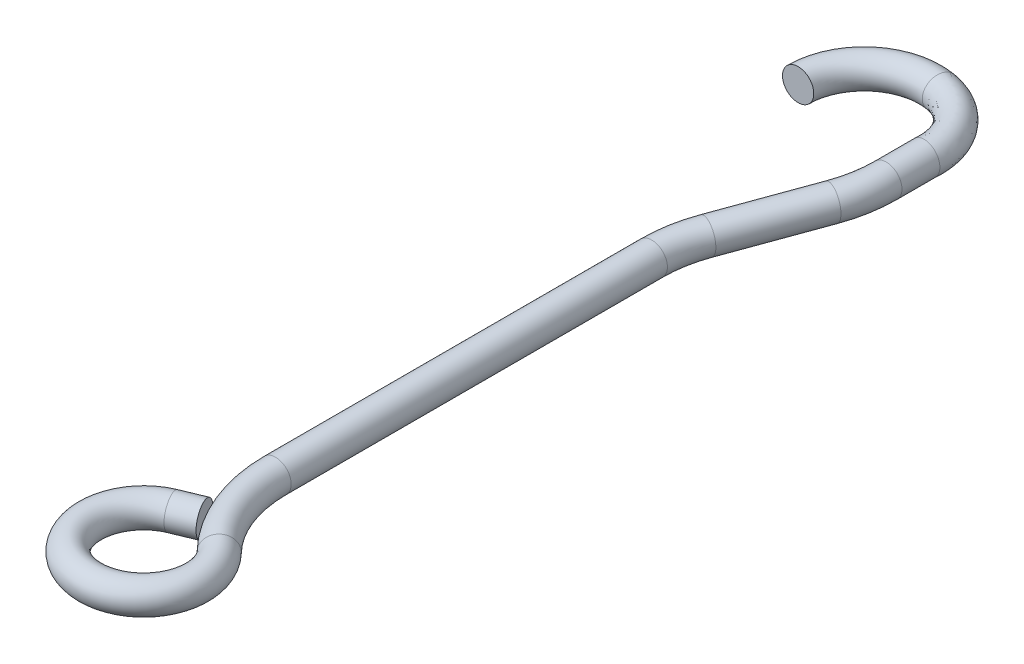
ISO-10303-21;
HEADER;
FILE_DESCRIPTION(('STEP AP214'),'2;1');
FILE_NAME('part.step','',(''),(''),'','','');
FILE_SCHEMA(('AUTOMOTIVE_DESIGN { 1 0 10303 214 1 1 1 1 }'));
ENDSEC;
DATA;
#1=APPLICATION_CONTEXT('core data for automotive mechanical design processes');
#2=APPLICATION_PROTOCOL_DEFINITION('international standard','automotive_design',2000,#1);
#3=PRODUCT_CONTEXT('',#1,'mechanical');
#4=PRODUCT('Part','Part','',(#3));
#5=PRODUCT_RELATED_PRODUCT_CATEGORY('part','',(#4));
#6=PRODUCT_DEFINITION_FORMATION('','',#4);
#7=PRODUCT_DEFINITION_CONTEXT('part definition',#1,'design');
#8=PRODUCT_DEFINITION('design','',#6,#7);
#9=PRODUCT_DEFINITION_SHAPE('','',#8);
#10=(LENGTH_UNIT() NAMED_UNIT(*) SI_UNIT(.MILLI.,.METRE.));
#11=(NAMED_UNIT(*) PLANE_ANGLE_UNIT() SI_UNIT($,.RADIAN.));
#12=(NAMED_UNIT(*) SI_UNIT($,.STERADIAN.) SOLID_ANGLE_UNIT());
#13=UNCERTAINTY_MEASURE_WITH_UNIT(LENGTH_MEASURE(1.E-05),#10,'distance_accuracy_value','');
#14=(GEOMETRIC_REPRESENTATION_CONTEXT(3) GLOBAL_UNCERTAINTY_ASSIGNED_CONTEXT((#13)) GLOBAL_UNIT_ASSIGNED_CONTEXT((#10,
#11,#12)) REPRESENTATION_CONTEXT('',''));
#15=CARTESIAN_POINT('',(0.,0.,0.));
#16=DIRECTION('',(0.,0.,1.));
#17=DIRECTION('',(1.,0.,0.));
#18=AXIS2_PLACEMENT_3D('',#15,#16,#17);
#19=CARTESIAN_POINT('',(0.155683718876011,0.,-0.389798905004367));
#20=DIRECTION('',(0.923582164777119,0.,-0.383400554127939));
#21=DIRECTION('',(-0.383400554127939,0.,-0.923582164777119));
#22=AXIS2_PLACEMENT_3D('',#19,#20,#21);
#23=PLANE('',#22);
#24=CARTESIAN_POINT('',(0.155683718876011,0.,-0.389798905004367));
#25=DIRECTION('',(0.923582164777119,0.,-0.383400554127939));
#26=DIRECTION('',(-0.383400554127939,0.,-0.923582164777119));
#27=AXIS2_PLACEMENT_3D('',#24,#25,#26);
#28=CIRCLE('',#27,1.15);
#29=CARTESIAN_POINT('',(-0.285226918371119,0.,-1.45191839449805));
#30=VERTEX_POINT('',#29);
#31=EDGE_CURVE('E53',#30,#30,#28,.T.);
#32=ORIENTED_EDGE('',*,*,#31,.T.);
#33=EDGE_LOOP('',(#32));
#34=FACE_BOUND('',#33,.T.);
#35=ADVANCED_FACE('F51',(#34),#23,.T.);
#36=CARTESIAN_POINT('',(-5.66038446641563,0.,-49.8347110424094));
#37=DIRECTION('',(0.,0.,-1.));
#38=DIRECTION('',(-1.,0.,0.));
#39=AXIS2_PLACEMENT_3D('',#36,#37,#38);
#40=PLANE('',#39);
#41=CARTESIAN_POINT('',(-5.66038446641563,0.,-49.8347110424094));
#42=DIRECTION('',(0.,0.,-1.));
#43=DIRECTION('',(-1.,0.,0.));
#44=AXIS2_PLACEMENT_3D('',#41,#42,#43);
#45=CIRCLE('',#44,1.15);
#46=CARTESIAN_POINT('',(-6.81038446641563,0.,-49.8347110424094));
#47=VERTEX_POINT('',#46);
#48=EDGE_CURVE('E73',#47,#47,#45,.T.);
#49=ORIENTED_EDGE('',*,*,#48,.F.);
#50=EDGE_LOOP('',(#49));
#51=FACE_BOUND('',#50,.T.);
#52=ADVANCED_FACE('F100',(#51),#40,.F.);
#53=CARTESIAN_POINT('',(-6.34038446641562,0.,-46.9979808494939));
#54=DIRECTION('',(0.,-1.,0.));
#55=DIRECTION('',(0.,0.,-1.));
#56=AXIS2_PLACEMENT_3D('',#53,#54,#55);
#57=TOROIDAL_SURFACE('',#56,10.,1.15);
#58=CARTESIAN_POINT('',(3.65961553358438,0.,-46.9979808494939));
#59=DIRECTION('',(0.,0.,1.));
#60=DIRECTION('',(1.,0.,0.));
#61=AXIS2_PLACEMENT_3D('',#58,#59,#60);
#62=CIRCLE('',#61,1.15);
#63=CARTESIAN_POINT('',(4.80961553358438,0.,-46.9979808494939));
#64=VERTEX_POINT('',#63);
#65=EDGE_CURVE('E165',#64,#64,#62,.T.);
#66=CARTESIAN_POINT('',(3.05654174144355,0.,-43.5777794162374));
#67=DIRECTION('',(-0.342020143325645,0.,0.939692620785917));
#68=DIRECTION('',(0.939692620785917,0.,0.342020143325645));
#69=AXIS2_PLACEMENT_3D('',#66,#67,#68);
#70=CIRCLE('',#69,1.15);
#71=CARTESIAN_POINT('',(4.13718825534735,0.,-43.1844562514129));
#72=VERTEX_POINT('',#71);
#73=EDGE_CURVE('E162',#72,#72,#70,.T.);
#74=CARTESIAN_POINT('',(-6.34038446641562,0.,-46.9979808494939));
#75=DIRECTION('',(0.,-1.,0.));
#76=DIRECTION('',(0.,0.,-1.));
#77=AXIS2_PLACEMENT_3D('',#74,#75,#76);
#78=CIRCLE('',#77,11.15);
#79=EDGE_CURVE('',#64,#72,#78,.T.);
#80=ORIENTED_EDGE('',*,*,#65,.T.);
#81=ORIENTED_EDGE('',*,*,#73,.F.);
#82=ORIENTED_EDGE('',*,*,#79,.T.);
#83=ORIENTED_EDGE('',*,*,#79,.F.);
#84=EDGE_LOOP('',(#80,#82,#81,#83));
#85=FACE_BOUND('',#84,.T.);
#86=ADVANCED_FACE('F93',(#85),#57,.T.);
#87=CARTESIAN_POINT('',(3.05654174144355,0.,-43.5777794162374));
#88=DIRECTION('',(-0.342020143325641,0.,0.939692620785918));
#89=DIRECTION('',(0.939692620785919,0.,0.342020143325641));
#90=AXIS2_PLACEMENT_3D('',#87,#88,#89);
#91=CYLINDRICAL_SURFACE('',#90,1.15);
#92=CARTESIAN_POINT('',(0.603073792140835,0.,-36.836931626172));
#93=DIRECTION('',(-0.342020143325641,0.,0.939692620785918));
#94=DIRECTION('',(0.939692620785918,0.,0.342020143325641));
#95=AXIS2_PLACEMENT_3D('',#92,#93,#94);
#96=CIRCLE('',#95,1.15);
#97=CARTESIAN_POINT('',(-0.477572721762971,0.,-37.2302547909965));
#98=VERTEX_POINT('',#97);
#99=EDGE_CURVE('E158',#98,#98,#96,.T.);
#100=ORIENTED_EDGE('',*,*,#99,.F.);
#101=EDGE_LOOP('',(#100));
#102=FACE_BOUND('',#101,.T.);
#103=ORIENTED_EDGE('',*,*,#73,.T.);
#104=EDGE_LOOP('',(#103));
#105=FACE_BOUND('',#104,.T.);
#106=ADVANCED_FACE('F96',(#102,#105),#91,.T.);
#107=CARTESIAN_POINT('',(10.,0.,-33.4167301929155));
#108=DIRECTION('',(0.,1.,0.));
#109=DIRECTION('',(0.,0.,1.));
#110=AXIS2_PLACEMENT_3D('',#107,#108,#109);
#111=TOROIDAL_SURFACE('',#110,10.,1.15);
#112=CARTESIAN_POINT('',(0.,0.,-33.4167301929155));
#113=DIRECTION('',(0.,0.,1.));
#114=DIRECTION('',(1.,0.,0.));
#115=AXIS2_PLACEMENT_3D('',#112,#113,#114);
#116=CIRCLE('',#115,1.15);
#117=CARTESIAN_POINT('',(-1.15,0.,-33.4167301929155));
#118=VERTEX_POINT('',#117);
#119=EDGE_CURVE('E159',#118,#118,#116,.T.);
#120=CARTESIAN_POINT('',(10.,0.,-33.4167301929155));
#121=DIRECTION('',(0.,1.,0.));
#122=DIRECTION('',(0.,0.,1.));
#123=AXIS2_PLACEMENT_3D('',#120,#121,#122);
#124=CIRCLE('',#123,11.15);
#125=EDGE_CURVE('',#98,#118,#124,.T.);
#126=ORIENTED_EDGE('',*,*,#99,.T.);
#127=ORIENTED_EDGE('',*,*,#119,.F.);
#128=ORIENTED_EDGE('',*,*,#125,.T.);
#129=ORIENTED_EDGE('',*,*,#125,.F.);
#130=EDGE_LOOP('',(#126,#128,#127,#129));
#131=FACE_BOUND('',#130,.T.);
#132=ADVANCED_FACE('F101',(#131),#111,.T.);
#133=CARTESIAN_POINT('',(0.,0.,-33.4167301929155));
#134=DIRECTION('',(0.,0.,1.));
#135=DIRECTION('',(1.,0.,0.));
#136=AXIS2_PLACEMENT_3D('',#133,#134,#135);
#137=CYLINDRICAL_SURFACE('',#136,1.15);
#138=CARTESIAN_POINT('',(0.,0.,-5.76767497908649));
#139=DIRECTION('',(0.,0.,1.));
#140=DIRECTION('',(1.,0.,0.));
#141=AXIS2_PLACEMENT_3D('',#138,#139,#140);
#142=CIRCLE('',#141,1.15);
#143=CARTESIAN_POINT('',(-1.15,0.,-5.76767497908649));
#144=VERTEX_POINT('',#143);
#145=EDGE_CURVE('E153',#144,#144,#142,.T.);
#146=ORIENTED_EDGE('',*,*,#145,.F.);
#147=EDGE_LOOP('',(#146));
#148=FACE_BOUND('',#147,.T.);
#149=ORIENTED_EDGE('',*,*,#119,.T.);
#150=EDGE_LOOP('',(#149));
#151=FACE_BOUND('',#150,.T.);
#152=ADVANCED_FACE('F110',(#148,#151),#137,.T.);
#153=CARTESIAN_POINT('',(10.,0.,-5.76767497908648));
#154=DIRECTION('',(0.,1.,0.));
#155=DIRECTION('',(0.,0.,1.));
#156=AXIS2_PLACEMENT_3D('',#153,#154,#155);
#157=TOROIDAL_SURFACE('',#156,10.,1.15);
#158=CARTESIAN_POINT('',(2.82124910265612,0.,1.19404431674012));
#159=DIRECTION('',(0.696171929582662,0.,0.717875089734386));
#160=DIRECTION('',(0.717875089734386,0.,-0.696171929582662));
#161=AXIS2_PLACEMENT_3D('',#158,#159,#160);
#162=CIRCLE('',#161,1.15);
#163=CARTESIAN_POINT('',(1.99569274946158,0.,1.99464203576018));
#164=VERTEX_POINT('',#163);
#165=EDGE_CURVE('E147',#164,#164,#162,.T.);
#166=CARTESIAN_POINT('',(10.,0.,-5.76767497908648));
#167=DIRECTION('',(0.,1.,0.));
#168=DIRECTION('',(0.,0.,1.));
#169=AXIS2_PLACEMENT_3D('',#166,#167,#168);
#170=CIRCLE('',#169,11.15);
#171=EDGE_CURVE('',#144,#164,#170,.T.);
#172=ORIENTED_EDGE('',*,*,#145,.T.);
#173=ORIENTED_EDGE('',*,*,#165,.F.);
#174=ORIENTED_EDGE('',*,*,#171,.T.);
#175=ORIENTED_EDGE('',*,*,#171,.F.);
#176=EDGE_LOOP('',(#172,#174,#173,#175));
#177=FACE_BOUND('',#176,.T.);
#178=ADVANCED_FACE('F111',(#177),#157,.T.);
#179=CARTESIAN_POINT('',(0.,0.,3.93));
#180=DIRECTION('',(0.,-1.,0.));
#181=DIRECTION('',(0.,0.,-1.));
#182=AXIS2_PLACEMENT_3D('',#179,#180,#181);
#183=TOROIDAL_SURFACE('',#182,3.93,1.15);
#184=CARTESIAN_POINT('',(-1.50676417772281,0.,0.300322092425927));
#185=DIRECTION('',(0.923582164777119,0.,-0.38340055412794));
#186=DIRECTION('',(-0.38340055412794,0.,-0.923582164777119));
#187=AXIS2_PLACEMENT_3D('',#184,#185,#186);
#188=CIRCLE('',#187,1.15);
#189=CARTESIAN_POINT('',(-1.94767481496994,0.,-0.76179739706776));
#190=VERTEX_POINT('',#189);
#191=EDGE_CURVE('E144',#190,#190,#188,.T.);
#192=ORIENTED_EDGE('',*,*,#191,.F.);
#193=EDGE_LOOP('',(#192));
#194=FACE_BOUND('',#193,.T.);
#195=ORIENTED_EDGE('',*,*,#165,.T.);
#196=EDGE_LOOP('',(#195));
#197=FACE_BOUND('',#196,.T.);
#198=ADVANCED_FACE('F114',(#194,#197),#183,.T.);
#199=CARTESIAN_POINT('',(-1.5067641777228,0.,0.300322092425923));
#200=DIRECTION('',(0.923582164777119,0.,-0.383400554127939));
#201=DIRECTION('',(-0.383400554127939,0.,-0.923582164777119));
#202=AXIS2_PLACEMENT_3D('',#199,#200,#201);
#203=CYLINDRICAL_SURFACE('',#202,1.15);
#204=ORIENTED_EDGE('',*,*,#31,.F.);
#205=EDGE_LOOP('',(#204));
#206=FACE_BOUND('',#205,.T.);
#207=ORIENTED_EDGE('',*,*,#191,.T.);
#208=EDGE_LOOP('',(#207));
#209=FACE_BOUND('',#208,.T.);
#210=ADVANCED_FACE('F118',(#206,#209),#203,.T.);
#211=CARTESIAN_POINT('',(3.65961553358438,0.,-50.0347110424094));
#212=DIRECTION('',(0.,0.,1.));
#213=DIRECTION('',(1.,0.,0.));
#214=AXIS2_PLACEMENT_3D('',#211,#212,#213);
#215=CYLINDRICAL_SURFACE('',#214,1.15);
#216=CARTESIAN_POINT('',(3.65961553358434,-1.15,-49.8347110424094));
#217=CARTESIAN_POINT('',(3.65239123608128,-1.15000048023457,-49.8350646355477));
#218=CARTESIAN_POINT('',(3.64516485481045,-1.14993231633093,-49.8354183334481));
#219=CARTESIAN_POINT('',(3.57337523201266,-1.14857491632452,-49.8389321302771));
#220=CARTESIAN_POINT('',(3.50877555358876,-1.1418885346046,-49.8420942286227));
#221=CARTESIAN_POINT('',(3.41345573593132,-1.12381573920411,-49.8467603531791));
#222=CARTESIAN_POINT('',(3.38189793429044,-1.11643317319093,-49.8483052317189));
#223=CARTESIAN_POINT('',(3.31948451226607,-1.09902684238169,-49.8513607081092));
#224=CARTESIAN_POINT('',(3.28862945931172,-1.08900102009443,-49.852871278255));
#225=CARTESIAN_POINT('',(3.19761821885201,-1.05510135969071,-49.8573270419652));
#226=CARTESIAN_POINT('',(3.13884950277413,-1.0273735769866,-49.8602044368802));
#227=CARTESIAN_POINT('',(3.02680362703252,-0.962414839505182,-49.8656906046553));
#228=CARTESIAN_POINT('',(2.9735266881337,-0.925183502901864,-49.8682993667167));
#229=CARTESIAN_POINT('',(2.89890636067264,-0.863060165049558,-49.8719533565997));
#230=CARTESIAN_POINT('',(2.87490762409002,-0.841297221248868,-49.8731285433783));
#231=CARTESIAN_POINT('',(2.82884899731818,-0.795847340345566,-49.8753840086658));
#232=CARTESIAN_POINT('',(2.80678725849197,-0.772162280161057,-49.8764643776667));
#233=CARTESIAN_POINT('',(2.74370101899541,-0.698411527393459,-49.8795537662777));
#234=CARTESIAN_POINT('',(2.70576083845067,-0.645638037396489,-49.8814117852233));
#235=CARTESIAN_POINT('',(2.63934699232064,-0.534547303886282,-49.8846642767486));
#236=CARTESIAN_POINT('',(2.61086206713245,-0.476236761304731,-49.8860593006762));
#237=CARTESIAN_POINT('',(2.56408093729268,-0.355645865094051,-49.8883503852572));
#238=CARTESIAN_POINT('',(2.54578447751303,-0.293365610913492,-49.8892464584046));
#239=CARTESIAN_POINT('',(2.51992520511049,-0.166679356577893,-49.8905129262122));
#240=CARTESIAN_POINT('',(2.51235131076741,-0.10227562159869,-49.8908838635976));
#241=CARTESIAN_POINT('',(2.50811550582934,0.0268904752345008,-49.891091315155));
#242=CARTESIAN_POINT('',(2.51145356029041,0.0916528359393792,-49.8909278310383));
#243=CARTESIAN_POINT('',(2.52894434472003,0.219666005165362,-49.8900712099288));
#244=CARTESIAN_POINT('',(2.5430917490268,0.28291754223331,-49.8893783337623));
#245=CARTESIAN_POINT('',(2.58178307704099,0.406140283507483,-49.887483428334));
#246=CARTESIAN_POINT('',(2.60632715406122,0.466111439325386,-49.8862813915639));
#247=CARTESIAN_POINT('',(2.66514959883975,0.58112409537534,-49.8834006361907));
#248=CARTESIAN_POINT('',(2.69943115422877,0.636163973545598,-49.8817217614913));
#249=CARTESIAN_POINT('',(2.75734536270624,0.713760688214895,-49.8788855955511));
#250=CARTESIAN_POINT('',(2.7777357634186,0.73880259301998,-49.8778870507856));
#251=CARTESIAN_POINT('',(2.82056579784068,0.787107507922113,-49.8757896383243));
#252=CARTESIAN_POINT('',(2.84300738440356,0.810368783219253,-49.8746906750242));
#253=CARTESIAN_POINT('',(2.91322188111463,0.877252920138835,-49.8712523334195));
#254=CARTESIAN_POINT('',(2.96385187024173,0.917932414148231,-49.8687731027707));
#255=CARTESIAN_POINT('',(3.07121897427257,0.990190360345042,-49.8635158333854));
#256=CARTESIAN_POINT('',(3.1279559557164,1.0217690113634,-49.8607378011789));
#257=CARTESIAN_POINT('',(3.21641725509471,1.06166254108794,-49.8564066852489));
#258=CARTESIAN_POINT('',(3.24650199758887,1.07372466704358,-49.8549337584675));
#259=CARTESIAN_POINT('',(3.30754882124104,1.09526108360566,-49.8519450403618));
#260=CARTESIAN_POINT('',(3.33851014732822,1.10473753084427,-49.8504292859307));
#261=CARTESIAN_POINT('',(3.43232386736804,1.12915723826234,-49.8458366537412));
#262=CARTESIAN_POINT('',(3.49626951937271,1.14016442603857,-49.8427064011124));
#263=CARTESIAN_POINT('',(3.58632320068504,1.14795465396804,-49.8382984167378));
#264=CARTESIAN_POINT('',(3.61212223113927,1.14930936306255,-49.8370356296547));
#265=CARTESIAN_POINT('',(3.64516284837927,1.14993176974541,-49.8354184318823));
#266=CARTESIAN_POINT('',(3.65238899740543,1.14999985329596,-49.8350647452815));
#267=CARTESIAN_POINT('',(3.65961553358438,1.15,-49.8347110424094));
#268=B_SPLINE_CURVE_WITH_KNOTS('',3,(#216,#217,#218,#219,#220,#221,#222,#223,#224,#225,#226,
#227,#228,#229,#230,#231,#232,#233,#234,#235,#236,#237,#238,#239,#240,#241,#242,#243,#244,#245,
#246,#247,#248,#249,#250,#251,#252,#253,#254,#255,#256,#257,#258,#259,#260,#261,#262,#263,#264,
#265,#266,#267),.UNSPECIFIED.,.F.,.F.,(4,2,2,2,2,2,2,2,2,2,2,2,2,2,2,2,2,2,2,2,2,2,2,2,2,4),(0.,
0.0217044345220954,0.215606321914907,0.312860046159394,0.410189696643159,0.604346660700096,
0.798511426664631,0.895664901596639,0.992724623505894,1.18678749827462,1.38061844106142,
1.57444452993399,1.76807015386866,1.96169515774575,2.15522482592884,2.34875734806429,
2.54235329756549,2.63918146886904,2.73610280627301,2.93010706251894,3.12410707992961,
3.22134204245051,3.31849565474118,3.51227089316106,3.58982515443558,3.61152958895764),.UNSPECIFIED.);
#269=CARTESIAN_POINT('',(3.65961553358434,-1.15,-49.8347110424094));
#270=VERTEX_POINT('',#269);
#271=CARTESIAN_POINT('',(3.65961553358438,1.15,-49.8347110424094));
#272=VERTEX_POINT('',#271);
#273=EDGE_CURVE('E12',#270,#272,#268,.T.);
#274=ORIENTED_EDGE('',*,*,#273,.F.);
#275=CARTESIAN_POINT('',(3.65961553358434,-1.15,-49.8347110424094));
#276=CARTESIAN_POINT('',(3.666839830118,-1.15000048028079,-49.8343574403375));
#277=CARTESIAN_POINT('',(3.67406623302125,-1.1499323163604,-49.8340041810967));
#278=CARTESIAN_POINT('',(3.74584116434519,-1.14857518999283,-49.8304999144773));
#279=CARTESIAN_POINT('',(3.81042784978253,-1.14189154588241,-49.8273820718106));
#280=CARTESIAN_POINT('',(3.90573134908817,-1.12382520271084,-49.822834514546));
#281=CARTESIAN_POINT('',(3.93728420587197,-1.11644519491439,-49.8213379730016));
#282=CARTESIAN_POINT('',(3.9996887370076,-1.09904458696038,-49.8183954094965));
#283=CARTESIAN_POINT('',(4.03053984462789,-1.08902192948496,-49.8169494278947));
#284=CARTESIAN_POINT('',(4.12154110948484,-1.05513224865425,-49.8127091925062));
#285=CARTESIAN_POINT('',(4.18030515129154,-1.02741186977946,-49.8100047419814));
#286=CARTESIAN_POINT('',(4.29234422729099,-0.962469081149231,-49.8049040449945));
#287=CARTESIAN_POINT('',(4.34561904109215,-0.925246290082038,-49.8025078109062));
#288=CARTESIAN_POINT('',(4.42023502620204,-0.863138955644779,-49.7991836950299));
#289=CARTESIAN_POINT('',(4.44423106947094,-0.841383108106244,-49.798120401961));
#290=CARTESIAN_POINT('',(4.49028513383814,-0.795948235706674,-49.7960890372383));
#291=CARTESIAN_POINT('',(4.5123450029348,-0.772271087129961,-49.7951208746786));
#292=CARTESIAN_POINT('',(4.57542697759465,-0.698545337963955,-49.792363895199));
#293=CARTESIAN_POINT('',(4.61336605938242,-0.645790251071017,-49.7907219386104));
#294=CARTESIAN_POINT('',(4.67978741167719,-0.534730962629809,-49.7878646232018));
#295=CARTESIAN_POINT('',(4.70827949775659,-0.476432602208914,-49.786648821525));
#296=CARTESIAN_POINT('',(4.75507778783149,-0.355867079159292,-49.7846596082803));
#297=CARTESIAN_POINT('',(4.77338422861875,-0.293600008831035,-49.7838861864283));
#298=CARTESIAN_POINT('',(4.7992710589524,-0.166920657282973,-49.782794270338));
#299=CARTESIAN_POINT('',(4.80685930590268,-0.102509983012579,-49.7824754428395));
#300=CARTESIAN_POINT('',(4.81112111850096,0.0266720465146103,-49.7822962513845));
#301=CARTESIAN_POINT('',(4.80779470609842,0.0914434010458121,-49.7824358865061));
#302=CARTESIAN_POINT('',(4.79032240416472,0.219488108328435,-49.783171554704));
#303=CARTESIAN_POINT('',(4.77617997264863,0.282761933194306,-49.783767441911));
#304=CARTESIAN_POINT('',(4.73749076104426,0.406030161752446,-49.7854061554519));
#305=CARTESIAN_POINT('',(4.71294382268048,0.466024515541047,-49.7864489885849));
#306=CARTESIAN_POINT('',(4.65411024765136,0.581076695125408,-49.7889667897276));
#307=CARTESIAN_POINT('',(4.61982142526965,0.636133409447271,-49.7904418547164));
#308=CARTESIAN_POINT('',(4.56189161152739,0.713753646102939,-49.7929568075434));
#309=CARTESIAN_POINT('',(4.54149527806366,0.738803051969273,-49.7938456774783));
#310=CARTESIAN_POINT('',(4.49865192249566,0.787122130434231,-49.7957215951399));
#311=CARTESIAN_POINT('',(4.47620295043638,0.810390071320537,-49.7967087363025));
#312=CARTESIAN_POINT('',(4.40603450072854,0.877225733208466,-49.7998099942234));
#313=CARTESIAN_POINT('',(4.35546743322295,0.917860134984403,-49.8020650702215));
#314=CARTESIAN_POINT('',(4.24823924629482,0.990050345428309,-49.8069036227703));
#315=CARTESIAN_POINT('',(4.19157825883613,1.02160635063461,-49.80948709221));
#316=CARTESIAN_POINT('',(4.1031786828803,1.0615109222306,-49.8135675053378));
#317=CARTESIAN_POINT('',(4.07307451470539,1.07359244076212,-49.8149651289186));
#318=CARTESIAN_POINT('',(4.01198718488543,1.09516375609348,-49.8178183515296));
#319=CARTESIAN_POINT('',(3.9810047776176,1.10465570697528,-49.8192739012131));
#320=CARTESIAN_POINT('',(3.88712627636806,1.12911587748979,-49.8237112701073));
#321=CARTESIAN_POINT('',(3.82313533292709,1.14014207068263,-49.8267713460371));
#322=CARTESIAN_POINT('',(3.7329939122336,1.14795014615149,-49.8311327011913));
#323=CARTESIAN_POINT('',(3.70715177890367,1.14930855340466,-49.8323888157985));
#324=CARTESIAN_POINT('',(3.6740682396597,1.14993176955108,-49.8340040916946));
#325=CARTESIAN_POINT('',(3.6668420689817,1.14999985309959,-49.8343573409885));
#326=CARTESIAN_POINT('',(3.65961553358438,1.15,-49.8347110424094));
#327=B_SPLINE_CURVE_WITH_KNOTS('',3,(#275,#276,#277,#278,#279,#280,#281,#282,#283,#284,#285,
#286,#287,#288,#289,#290,#291,#292,#293,#294,#295,#296,#297,#298,#299,#300,#301,#302,#303,#304,
#305,#306,#307,#308,#309,#310,#311,#312,#313,#314,#315,#316,#317,#318,#319,#320,#321,#322,#323,
#324,#325,#326),.UNSPECIFIED.,.F.,.F.,(4,2,2,2,2,2,2,2,2,2,2,2,2,2,2,2,2,2,2,2,2,2,2,2,2,4),(0.,
0.021704434572769,0.215560896288577,0.312791654011654,0.410098331084587,0.604210906064723,
0.798331271597751,0.895452939196065,0.992480876546018,1.18648037881426,1.38027767634034,
1.5740704683572,1.76772111889341,1.96137137999697,2.15495975458562,2.34855107418638,
2.54218586282467,2.63903301371138,2.73597314225271,2.92972451085728,3.12347168462021,
3.22077198539768,3.31799110028772,3.51189715748427,3.58957976434581,3.61128419891854),.UNSPECIFIED.);
#328=EDGE_CURVE('E56',#270,#272,#327,.T.);
#329=ORIENTED_EDGE('',*,*,#328,.T.);
#330=EDGE_LOOP('',(#274,#329));
#331=FACE_BOUND('',#330,.T.);
#332=ORIENTED_EDGE('',*,*,#65,.F.);
#333=EDGE_LOOP('',(#332));
#334=FACE_BOUND('',#333,.T.);
#335=ADVANCED_FACE('F68',(#331,#334),#215,.T.);
#336=CARTESIAN_POINT('',(-0.807450620557308,0.,-49.8347110424094));
#337=DIRECTION('',(0.,-1.,0.));
#338=DIRECTION('',(0.,0.,-1.));
#339=AXIS2_PLACEMENT_3D('',#336,#337,#338);
#340=TOROIDAL_SURFACE('',#339,4.85293384585832,1.15);
#341=CARTESIAN_POINT('',(0.,0.,-54.62));
#342=DIRECTION('',(0.986061032271145,0.,0.166384015567494));
#343=DIRECTION('',(0.166384015567494,0.,-0.986061032271145));
#344=AXIS2_PLACEMENT_3D('',#341,#342,#343);
#345=CIRCLE('',#344,1.15);
#346=CARTESIAN_POINT('',(0.191341617902618,0.,-55.7539701871118));
#347=VERTEX_POINT('',#346);
#348=EDGE_CURVE('E74',#347,#347,#345,.T.);
#349=CARTESIAN_POINT('',(-0.807450620557308,0.,-49.8347110424094));
#350=DIRECTION('',(0.,-1.,0.));
#351=DIRECTION('',(0.,0.,-1.));
#352=AXIS2_PLACEMENT_3D('',#349,#350,#351);
#353=CIRCLE('',#352,6.00293384585832);
#354=EDGE_CURVE('',#47,#347,#353,.T.);
#355=ORIENTED_EDGE('',*,*,#48,.T.);
#356=ORIENTED_EDGE('',*,*,#348,.F.);
#357=ORIENTED_EDGE('',*,*,#354,.T.);
#358=ORIENTED_EDGE('',*,*,#354,.F.);
#359=EDGE_LOOP('',(#355,#357,#356,#358));
#360=FACE_BOUND('',#359,.T.);
#361=ADVANCED_FACE('F123',(#360),#340,.T.);
#362=CARTESIAN_POINT('',(0.191341617902616,0.,-55.7539701871118));
#363=CARTESIAN_POINT('',(1.56467178391263,0.,-55.5222399186573));
#364=CARTESIAN_POINT('',(2.84007997153396,0.,-54.7533157947049));
#365=CARTESIAN_POINT('',(4.10917160624838,0.,-53.0938600050669));
#366=CARTESIAN_POINT('',(4.42658623260287,0.,-52.4616497688422));
#367=CARTESIAN_POINT('',(4.71296659598451,0.,-51.4570870135327));
#368=CARTESIAN_POINT('',(4.77692195319781,0.,-51.1131971309664));
#369=CARTESIAN_POINT('',(4.82387305706921,0.,-50.5928954666565));
#370=CARTESIAN_POINT('',(4.83138039855777,0.,-50.4187153156688));
#371=CARTESIAN_POINT('',(4.83002447965206,0.,-50.0702715185446));
#372=CARTESIAN_POINT('',(4.81939196485375,0.,-49.8780670389535));
#373=CARTESIAN_POINT('',(4.79675469539334,0.,-49.6473535401419));
#374=CARTESIAN_POINT('',(4.79108409930875,0.,-49.5896464334684));
#375=CARTESIAN_POINT('',(4.78456993600003,0.,-49.5232987875355));
#376=CARTESIAN_POINT('',(0.191341617902629,2.3,-55.7539701871118));
#377=CARTESIAN_POINT('',(1.56467178391264,2.3,-55.5222399186573));
#378=CARTESIAN_POINT('',(2.84007997153396,2.3,-54.7533157947049));
#379=CARTESIAN_POINT('',(4.10917160624838,2.3,-53.0938600050669));
#380=CARTESIAN_POINT('',(4.42658623260287,2.3,-52.4616497688422));
#381=CARTESIAN_POINT('',(4.71296659598451,2.3,-51.4570870135327));
#382=CARTESIAN_POINT('',(4.77692195319781,2.3,-51.1131971309664));
#383=CARTESIAN_POINT('',(4.82387305706921,2.3,-50.5928954666565));
#384=CARTESIAN_POINT('',(4.83138039855777,2.3,-50.4187153156688));
#385=CARTESIAN_POINT('',(4.83002447965206,2.3,-50.0702715185446));
#386=CARTESIAN_POINT('',(4.81939196485375,2.3,-49.8780670389535));
#387=CARTESIAN_POINT('',(4.79675469539334,2.3,-49.6473535401419));
#388=CARTESIAN_POINT('',(4.79108409930875,2.3,-49.5896464334684));
#389=CARTESIAN_POINT('',(4.78456993600003,2.3,-49.5232987875355));
#390=CARTESIAN_POINT('',(-0.191341617902609,2.3,-53.4860298128882));
#391=CARTESIAN_POINT('',(0.614435142244716,2.3,-53.3500662481426));
#392=CARTESIAN_POINT('',(1.36275794379692,2.3,-52.898913856144));
#393=CARTESIAN_POINT('',(2.10737462160895,2.3,-51.9252580355161));
#394=CARTESIAN_POINT('',(2.29361194135655,2.3,-51.5543200568093));
#395=CARTESIAN_POINT('',(2.4616404658052,2.3,-50.9649109384678));
#396=CARTESIAN_POINT('',(2.49916512069494,2.3,-50.7631397385921));
#397=CARTESIAN_POINT('',(2.52671283594906,2.3,-50.4578621005244));
#398=CARTESIAN_POINT('',(2.53111763346353,2.3,-50.3556650315177));
#399=CARTESIAN_POINT('',(2.53032207244715,2.3,-50.1512219042279));
#400=CARTESIAN_POINT('',(2.52687892522554,2.3,-50.0669197912884));
#401=CARTESIAN_POINT('',(2.50945557765497,2.3,-49.8893727119831));
#402=CARTESIAN_POINT('',(2.5020903146252,2.3,-49.814385067619));
#403=CARTESIAN_POINT('',(2.49557615131644,2.3,-49.7480374216861));
#404=CARTESIAN_POINT('',(-0.191341617902616,0.,-53.4860298128882));
#405=CARTESIAN_POINT('',(0.614435142244709,0.,-53.3500662481426));
#406=CARTESIAN_POINT('',(1.36275794379692,0.,-52.898913856144));
#407=CARTESIAN_POINT('',(2.10737462160895,0.,-51.9252580355161));
#408=CARTESIAN_POINT('',(2.29361194135655,0.,-51.5543200568093));
#409=CARTESIAN_POINT('',(2.4616404658052,0.,-50.9649109384678));
#410=CARTESIAN_POINT('',(2.49916512069494,0.,-50.7631397385921));
#411=CARTESIAN_POINT('',(2.52671283594906,0.,-50.4578621005244));
#412=CARTESIAN_POINT('',(2.53111763346353,0.,-50.3556650315177));
#413=CARTESIAN_POINT('',(2.53032207244715,0.,-50.1512219042279));
#414=CARTESIAN_POINT('',(2.52687892522554,0.,-50.0669197912884));
#415=CARTESIAN_POINT('',(2.50945557765497,0.,-49.8893727119831));
#416=CARTESIAN_POINT('',(2.5020903146252,0.,-49.814385067619));
#417=CARTESIAN_POINT('',(2.49557615131644,0.,-49.7480374216861));
#418=CARTESIAN_POINT('',(-0.191341617902609,-2.3,-53.4860298128882));
#419=CARTESIAN_POINT('',(0.614435142244716,-2.3,-53.3500662481426));
#420=CARTESIAN_POINT('',(1.36275794379692,-2.3,-52.898913856144));
#421=CARTESIAN_POINT('',(2.10737462160895,-2.3,-51.9252580355161));
#422=CARTESIAN_POINT('',(2.29361194135655,-2.3,-51.5543200568093));
#423=CARTESIAN_POINT('',(2.4616404658052,-2.3,-50.9649109384678));
#424=CARTESIAN_POINT('',(2.49916512069494,-2.3,-50.7631397385921));
#425=CARTESIAN_POINT('',(2.52671283594906,-2.3,-50.4578621005244));
#426=CARTESIAN_POINT('',(2.53111763346353,-2.3,-50.3556650315177));
#427=CARTESIAN_POINT('',(2.53032207244715,-2.3,-50.1512219042279));
#428=CARTESIAN_POINT('',(2.52687892522554,-2.3,-50.0669197912884));
#429=CARTESIAN_POINT('',(2.50945557765497,-2.3,-49.8893727119831));
#430=CARTESIAN_POINT('',(2.5020903146252,-2.3,-49.814385067619));
#431=CARTESIAN_POINT('',(2.49557615131644,-2.3,-49.7480374216861));
#432=CARTESIAN_POINT('',(0.191341617902629,-2.3,-55.7539701871118));
#433=CARTESIAN_POINT('',(1.56467178391264,-2.3,-55.5222399186573));
#434=CARTESIAN_POINT('',(2.84007997153396,-2.3,-54.7533157947049));
#435=CARTESIAN_POINT('',(4.10917160624838,-2.3,-53.0938600050669));
#436=CARTESIAN_POINT('',(4.42658623260287,-2.3,-52.4616497688422));
#437=CARTESIAN_POINT('',(4.71296659598451,-2.3,-51.4570870135327));
#438=CARTESIAN_POINT('',(4.77692195319781,-2.3,-51.1131971309664));
#439=CARTESIAN_POINT('',(4.82387305706921,-2.3,-50.5928954666565));
#440=CARTESIAN_POINT('',(4.83138039855777,-2.3,-50.4187153156688));
#441=CARTESIAN_POINT('',(4.83002447965206,-2.3,-50.0702715185446));
#442=CARTESIAN_POINT('',(4.81939196485375,-2.3,-49.8780670389535));
#443=CARTESIAN_POINT('',(4.79675469539334,-2.3,-49.6473535401419));
#444=CARTESIAN_POINT('',(4.79108409930875,-2.3,-49.5896464334684));
#445=CARTESIAN_POINT('',(4.78456993600003,-2.3,-49.5232987875355));
#446=CARTESIAN_POINT('',(0.191341617902616,0.,-55.7539701871118));
#447=CARTESIAN_POINT('',(1.56467178391263,0.,-55.5222399186573));
#448=CARTESIAN_POINT('',(2.84007997153396,0.,-54.7533157947049));
#449=CARTESIAN_POINT('',(4.10917160624838,0.,-53.0938600050669));
#450=CARTESIAN_POINT('',(4.42658623260287,0.,-52.4616497688422));
#451=CARTESIAN_POINT('',(4.71296659598451,0.,-51.4570870135327));
#452=CARTESIAN_POINT('',(4.77692195319781,0.,-51.1131971309664));
#453=CARTESIAN_POINT('',(4.82387305706921,0.,-50.5928954666565));
#454=CARTESIAN_POINT('',(4.83138039855777,0.,-50.4187153156688));
#455=CARTESIAN_POINT('',(4.83002447965206,0.,-50.0702715185446));
#456=CARTESIAN_POINT('',(4.81939196485375,0.,-49.8780670389535));
#457=CARTESIAN_POINT('',(4.79675469539334,0.,-49.6473535401419));
#458=CARTESIAN_POINT('',(4.79108409930875,0.,-49.5896464334684));
#459=CARTESIAN_POINT('',(4.78456993600003,0.,-49.5232987875355));
#460=(BOUNDED_SURFACE() B_SPLINE_SURFACE(3,3,((#362,#363,#364,#365,#366,#367,#368,#369,#370,
#371,#372,#373,#374,#375),(#376,#377,#378,#379,#380,#381,#382,#383,#384,#385,#386,#387,#388,
#389),(#390,#391,#392,#393,#394,#395,#396,#397,#398,#399,#400,#401,#402,#403),(#404,#405,#406,
#407,#408,#409,#410,#411,#412,#413,#414,#415,#416,#417),(#418,#419,#420,#421,#422,#423,#424,
#425,#426,#427,#428,#429,#430,#431),(#432,#433,#434,#435,#436,#437,#438,#439,#440,#441,#442,
#443,#444,#445),(#446,#447,#448,#449,#450,#451,#452,#453,#454,#455,#456,#457,#458,#459)),
.UNSPECIFIED.,.T.,.F.,.F.) B_SPLINE_SURFACE_WITH_KNOTS((4,3,4),(4,2,2,2,2,2,4),(0.,0.5,1.),
(0.55989346822672,0.77994673411336,0.88997336705668,0.94498668352834,0.97249334176417,1.,
1.01324559465552),.UNSPECIFIED.) GEOMETRIC_REPRESENTATION_ITEM() RATIONAL_B_SPLINE_SURFACE(((1.,
1.,1.,1.,1.,1.,1.,1.,1.,1.,1.,1.,1.,1.),(0.333333333333333,0.333333333333333,0.333333333333333,
0.333333333333333,0.333333333333333,0.333333333333333,0.333333333333333,0.333333333333333,
0.333333333333333,0.333333333333333,0.333333333333333,0.333333333333333,0.333333333333333,
0.333333333333333),(0.333333333333333,0.333333333333333,0.333333333333333,0.333333333333333,
0.333333333333333,0.333333333333333,0.333333333333333,0.333333333333333,0.333333333333333,
0.333333333333333,0.333333333333333,0.333333333333333,0.333333333333333,0.333333333333333),(1.,
1.,1.,1.,1.,1.,1.,1.,1.,1.,1.,1.,1.,1.),(0.333333333333333,0.333333333333333,0.333333333333333,
0.333333333333333,0.333333333333333,0.333333333333333,0.333333333333333,0.333333333333333,
0.333333333333333,0.333333333333333,0.333333333333333,0.333333333333333,0.333333333333333,
0.333333333333333),(0.333333333333333,0.333333333333333,0.333333333333333,0.333333333333333,
0.333333333333333,0.333333333333333,0.333333333333333,0.333333333333333,0.333333333333333,
0.333333333333333,0.333333333333333,0.333333333333333,0.333333333333333,0.333333333333333),(1.,
1.,1.,1.,1.,1.,1.,1.,1.,1.,1.,1.,1.,1.))) REPRESENTATION_ITEM('') SURFACE());
#461=ORIENTED_EDGE('',*,*,#328,.F.);
#462=ORIENTED_EDGE('',*,*,#273,.T.);
#463=EDGE_LOOP('',(#461,#462));
#464=FACE_BOUND('',#463,.T.);
#465=ORIENTED_EDGE('',*,*,#348,.T.);
#466=EDGE_LOOP('',(#465));
#467=FACE_BOUND('',#466,.T.);
#468=ADVANCED_FACE('F70',(#464,#467),#460,.T.);
#469=CLOSED_SHELL('',(#35,#52,#86,#106,#132,#152,#178,#198,#210,#335,#361,#468));
#470=MANIFOLD_SOLID_BREP('B2',#469);
#471=ADVANCED_BREP_SHAPE_REPRESENTATION('',(#18,#470),#14);
#472=SHAPE_DEFINITION_REPRESENTATION(#9,#471);
ENDSEC;
END-ISO-10303-21;
